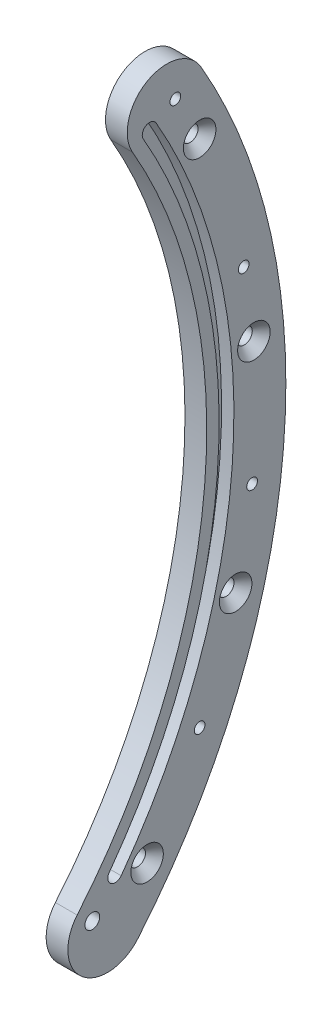
ISO-10303-21;
HEADER;
FILE_DESCRIPTION(('STEP AP214'),'2;1');
FILE_NAME('part.step','',(''),(''),'','','');
FILE_SCHEMA(('AUTOMOTIVE_DESIGN { 1 0 10303 214 1 1 1 1 }'));
ENDSEC;
DATA;
#1=APPLICATION_CONTEXT('core data for automotive mechanical design processes');
#2=APPLICATION_PROTOCOL_DEFINITION('international standard','automotive_design',2000,#1);
#3=PRODUCT_CONTEXT('',#1,'mechanical');
#4=PRODUCT('Part','Part','',(#3));
#5=PRODUCT_RELATED_PRODUCT_CATEGORY('part','',(#4));
#6=PRODUCT_DEFINITION_FORMATION('','',#4);
#7=PRODUCT_DEFINITION_CONTEXT('part definition',#1,'design');
#8=PRODUCT_DEFINITION('design','',#6,#7);
#9=PRODUCT_DEFINITION_SHAPE('','',#8);
#10=(LENGTH_UNIT() NAMED_UNIT(*) SI_UNIT(.MILLI.,.METRE.));
#11=(NAMED_UNIT(*) PLANE_ANGLE_UNIT() SI_UNIT($,.RADIAN.));
#12=(NAMED_UNIT(*) SI_UNIT($,.STERADIAN.) SOLID_ANGLE_UNIT());
#13=UNCERTAINTY_MEASURE_WITH_UNIT(LENGTH_MEASURE(1.E-05),#10,'distance_accuracy_value','');
#14=(GEOMETRIC_REPRESENTATION_CONTEXT(3) GLOBAL_UNCERTAINTY_ASSIGNED_CONTEXT((#13)) GLOBAL_UNIT_ASSIGNED_CONTEXT((#10,
#11,#12)) REPRESENTATION_CONTEXT('',''));
#15=CARTESIAN_POINT('',(0.,0.,0.));
#16=DIRECTION('',(0.,0.,1.));
#17=DIRECTION('',(1.,0.,0.));
#18=AXIS2_PLACEMENT_3D('',#15,#16,#17);
#19=CARTESIAN_POINT('',(-3.4925,95.2499999999996,-164.977839420936));
#20=DIRECTION('',(1.,0.,0.));
#21=DIRECTION('',(0.,0.,-1.));
#22=AXIS2_PLACEMENT_3D('',#19,#20,#21);
#23=CYLINDRICAL_SURFACE('',#22,12.7);
#24=CARTESIAN_POINT('',(3.4925,95.2499999999996,-164.977839420936));
#25=DIRECTION('',(1.,0.,0.));
#26=DIRECTION('',(0.,0.,-1.));
#27=AXIS2_PLACEMENT_3D('',#24,#25,#26);
#28=CIRCLE('',#27,12.7);
#29=CARTESIAN_POINT('',(3.4925,101.6,-175.976362048998));
#30=VERTEX_POINT('',#29);
#31=CARTESIAN_POINT('',(3.4925,88.8999999999996,-153.979316792873));
#32=VERTEX_POINT('',#31);
#33=EDGE_CURVE('E164',#30,#32,#28,.T.);
#34=ORIENTED_EDGE('',*,*,#33,.F.);
#35=DIRECTION('',(1.,0.,0.));
#36=VECTOR('',#35,1.);
#37=CARTESIAN_POINT('',(-3.4925,101.6,-175.976362048998));
#38=LINE('',#37,#36);
#39=CARTESIAN_POINT('',(-3.4925,101.6,-175.976362048998));
#40=VERTEX_POINT('',#39);
#41=EDGE_CURVE('E71',#40,#30,#38,.T.);
#42=ORIENTED_EDGE('',*,*,#41,.F.);
#43=CARTESIAN_POINT('',(-3.4925,95.2499999999996,-164.977839420936));
#44=DIRECTION('',(1.,0.,0.));
#45=DIRECTION('',(0.,0.,-1.));
#46=AXIS2_PLACEMENT_3D('',#43,#44,#45);
#47=CIRCLE('',#46,12.7);
#48=CARTESIAN_POINT('',(-3.4925,88.8999999999996,-153.979316792873));
#49=VERTEX_POINT('',#48);
#50=EDGE_CURVE('E169',#40,#49,#47,.T.);
#51=ORIENTED_EDGE('',*,*,#50,.T.);
#52=DIRECTION('',(1.,0.,0.));
#53=VECTOR('',#52,1.);
#54=CARTESIAN_POINT('',(-3.4925,88.8999999999996,-153.979316792873));
#55=LINE('',#54,#53);
#56=EDGE_CURVE('E100',#49,#32,#55,.T.);
#57=ORIENTED_EDGE('',*,*,#56,.T.);
#58=EDGE_LOOP('',(#34,#42,#51,#57));
#59=FACE_BOUND('',#58,.T.);
#60=ADVANCED_FACE('F43',(#59),#23,.T.);
#61=CARTESIAN_POINT('',(-3.4925,0.,0.));
#62=DIRECTION('',(1.,0.,0.));
#63=DIRECTION('',(0.,0.,-1.));
#64=AXIS2_PLACEMENT_3D('',#61,#62,#63);
#65=CYLINDRICAL_SURFACE('',#64,203.2);
#66=CARTESIAN_POINT('',(3.4925,0.,0.));
#67=DIRECTION('',(1.,0.,0.));
#68=DIRECTION('',(0.,0.,-1.));
#69=AXIS2_PLACEMENT_3D('',#66,#67,#68);
#70=CIRCLE('',#69,203.2);
#71=CARTESIAN_POINT('',(3.4925,-130.614442288306,-155.660230841776));
#72=VERTEX_POINT('',#71);
#73=EDGE_CURVE('E173',#72,#30,#70,.T.);
#74=ORIENTED_EDGE('',*,*,#73,.F.);
#75=DIRECTION('',(1.,0.,0.));
#76=VECTOR('',#75,1.);
#77=CARTESIAN_POINT('',(-3.4925,-130.614442288306,-155.660230841776));
#78=LINE('',#77,#76);
#79=CARTESIAN_POINT('',(-3.4925,-130.614442288306,-155.660230841776));
#80=VERTEX_POINT('',#79);
#81=EDGE_CURVE('E198',#80,#72,#78,.T.);
#82=ORIENTED_EDGE('',*,*,#81,.F.);
#83=CARTESIAN_POINT('',(-3.4925,0.,0.));
#84=DIRECTION('',(1.,0.,0.));
#85=DIRECTION('',(0.,0.,-1.));
#86=AXIS2_PLACEMENT_3D('',#83,#84,#85);
#87=CIRCLE('',#86,203.2);
#88=EDGE_CURVE('E180',#80,#40,#87,.T.);
#89=ORIENTED_EDGE('',*,*,#88,.T.);
#90=ORIENTED_EDGE('',*,*,#41,.T.);
#91=EDGE_LOOP('',(#74,#82,#89,#90));
#92=FACE_BOUND('',#91,.T.);
#93=ADVANCED_FACE('F229',(#92),#65,.T.);
#94=CARTESIAN_POINT('',(-3.4925,-122.451039645286,-145.931466414165));
#95=DIRECTION('',(1.,0.,0.));
#96=DIRECTION('',(0.,0.,-1.));
#97=AXIS2_PLACEMENT_3D('',#94,#95,#96);
#98=CYLINDRICAL_SURFACE('',#97,12.7);
#99=CARTESIAN_POINT('',(3.4925,-122.451039645286,-145.931466414165));
#100=DIRECTION('',(1.,0.,0.));
#101=DIRECTION('',(0.,0.,-1.));
#102=AXIS2_PLACEMENT_3D('',#99,#100,#101);
#103=CIRCLE('',#102,12.7);
#104=CARTESIAN_POINT('',(3.4925,-114.287637002267,-136.202701986554));
#105=VERTEX_POINT('',#104);
#106=EDGE_CURVE('E190',#105,#72,#103,.T.);
#107=ORIENTED_EDGE('',*,*,#106,.F.);
#108=DIRECTION('',(1.,0.,0.));
#109=VECTOR('',#108,1.);
#110=CARTESIAN_POINT('',(-3.4925,-114.287637002267,-136.202701986554));
#111=LINE('',#110,#109);
#112=CARTESIAN_POINT('',(-3.4925,-114.287637002267,-136.202701986554));
#113=VERTEX_POINT('',#112);
#114=EDGE_CURVE('E201',#113,#105,#111,.T.);
#115=ORIENTED_EDGE('',*,*,#114,.F.);
#116=CARTESIAN_POINT('',(-3.4925,-122.451039645286,-145.931466414165));
#117=DIRECTION('',(1.,0.,0.));
#118=DIRECTION('',(0.,0.,-1.));
#119=AXIS2_PLACEMENT_3D('',#116,#117,#118);
#120=CIRCLE('',#119,12.7);
#121=EDGE_CURVE('E176',#113,#80,#120,.T.);
#122=ORIENTED_EDGE('',*,*,#121,.T.);
#123=ORIENTED_EDGE('',*,*,#81,.T.);
#124=EDGE_LOOP('',(#107,#115,#122,#123));
#125=FACE_BOUND('',#124,.T.);
#126=ADVANCED_FACE('F228',(#125),#98,.T.);
#127=CARTESIAN_POINT('',(-3.4925,0.,0.));
#128=DIRECTION('',(1.,0.,0.));
#129=DIRECTION('',(0.,0.,-1.));
#130=AXIS2_PLACEMENT_3D('',#127,#128,#129);
#131=CYLINDRICAL_SURFACE('',#130,177.8);
#132=CARTESIAN_POINT('',(3.4925,0.,0.));
#133=DIRECTION('',(-1.,0.,0.));
#134=DIRECTION('',(0.,0.,1.));
#135=AXIS2_PLACEMENT_3D('',#132,#133,#134);
#136=CIRCLE('',#135,177.8);
#137=EDGE_CURVE('E186',#32,#105,#136,.T.);
#138=ORIENTED_EDGE('',*,*,#137,.F.);
#139=ORIENTED_EDGE('',*,*,#56,.F.);
#140=CARTESIAN_POINT('',(-3.4925,0.,0.));
#141=DIRECTION('',(-1.,0.,0.));
#142=DIRECTION('',(0.,0.,1.));
#143=AXIS2_PLACEMENT_3D('',#140,#141,#142);
#144=CIRCLE('',#143,177.8);
#145=EDGE_CURVE('E172',#49,#113,#144,.T.);
#146=ORIENTED_EDGE('',*,*,#145,.T.);
#147=ORIENTED_EDGE('',*,*,#114,.T.);
#148=EDGE_LOOP('',(#138,#139,#146,#147));
#149=FACE_BOUND('',#148,.T.);
#150=ADVANCED_FACE('F224',(#149),#131,.F.);
#151=CARTESIAN_POINT('',(-3.4925,47.6249999999998,-82.4889197104679));
#152=DIRECTION('',(1.,0.,0.));
#153=DIRECTION('',(0.,0.,-1.));
#154=AXIS2_PLACEMENT_3D('',#151,#152,#153);
#155=PLANE('',#154);
#156=CARTESIAN_POINT('',(-3.4925,96.8374999999974,-167.727470077952));
#157=DIRECTION('',(1.,0.,0.));
#158=DIRECTION('',(0.,0.,-1.));
#159=AXIS2_PLACEMENT_3D('',#156,#157,#158);
#160=CIRCLE('',#159,1.7272);
#161=CARTESIAN_POINT('',(-3.4925,96.8374999999974,-169.454670077952));
#162=VERTEX_POINT('',#161);
#163=EDGE_CURVE('E514',#162,#162,#160,.T.);
#164=ORIENTED_EDGE('',*,*,#163,.T.);
#165=EDGE_LOOP('',(#164));
#166=FACE_BOUND('',#165,.T.);
#167=CARTESIAN_POINT('',(-3.4925,39.1644883214046,-189.673794920444));
#168=DIRECTION('',(1.,0.,0.));
#169=DIRECTION('',(0.,0.,-1.));
#170=AXIS2_PLACEMENT_3D('',#167,#168,#169);
#171=CIRCLE('',#170,1.7272);
#172=CARTESIAN_POINT('',(-3.4925,39.1644883214046,-191.400994920444));
#173=VERTEX_POINT('',#172);
#174=EDGE_CURVE('E529',#173,#173,#171,.T.);
#175=ORIENTED_EDGE('',*,*,#174,.T.);
#176=EDGE_LOOP('',(#175));
#177=FACE_BOUND('',#176,.T.);
#178=CARTESIAN_POINT('',(-3.4925,-81.850591842633,-175.529160654322));
#179=DIRECTION('',(1.,0.,0.));
#180=DIRECTION('',(0.,0.,-1.));
#181=AXIS2_PLACEMENT_3D('',#178,#179,#180);
#182=CIRCLE('',#181,1.7272);
#183=CARTESIAN_POINT('',(-3.4925,-81.850591842633,-177.256360654322));
#184=VERTEX_POINT('',#183);
#185=EDGE_CURVE('E536',#184,#184,#182,.T.);
#186=ORIENTED_EDGE('',*,*,#185,.T.);
#187=EDGE_LOOP('',(#186));
#188=FACE_BOUND('',#187,.T.);
#189=CARTESIAN_POINT('',(-3.4925,-22.4842951432071,-192.36543893567));
#190=DIRECTION('',(1.,0.,0.));
#191=DIRECTION('',(0.,0.,-1.));
#192=AXIS2_PLACEMENT_3D('',#189,#190,#191);
#193=CIRCLE('',#192,1.7272);
#194=CARTESIAN_POINT('',(-3.4925,-22.4842951432071,-194.09263893567));
#195=VERTEX_POINT('',#194);
#196=EDGE_CURVE('E542',#195,#195,#193,.T.);
#197=ORIENTED_EDGE('',*,*,#196,.T.);
#198=EDGE_LOOP('',(#197));
#199=FACE_BOUND('',#198,.T.);
#200=CARTESIAN_POINT('',(-3.4925,-118.369338323777,-141.067084200359));
#201=DIRECTION('',(-1.,0.,0.));
#202=DIRECTION('',(0.,0.,1.));
#203=AXIS2_PLACEMENT_3D('',#200,#201,#202);
#204=CIRCLE('',#203,2.38125);
#205=CARTESIAN_POINT('',(-3.4925,-118.369338323777,-138.685834200359));
#206=VERTEX_POINT('',#205);
#207=EDGE_CURVE('E545',#206,#206,#204,.T.);
#208=ORIENTED_EDGE('',*,*,#207,.F.);
#209=EDGE_LOOP('',(#208));
#210=FACE_BOUND('',#209,.T.);
#211=CARTESIAN_POINT('',(-3.4925,81.8505918426279,-175.529160654327));
#212=DIRECTION('',(1.,0.,0.));
#213=DIRECTION('',(0.,0.,-1.));
#214=AXIS2_PLACEMENT_3D('',#211,#212,#213);
#215=CIRCLE('',#214,2.55270000000001);
#216=CARTESIAN_POINT('',(-3.4925,81.8505918426279,-178.081860654327));
#217=VERTEX_POINT('',#216);
#218=EDGE_CURVE('E555',#217,#217,#215,.T.);
#219=ORIENTED_EDGE('',*,*,#218,.T.);
#220=EDGE_LOOP('',(#219));
#221=FACE_BOUND('',#220,.T.);
#222=CARTESIAN_POINT('',(-3.4925,16.8798884766493,-192.938008152921));
#223=DIRECTION('',(1.,0.,0.));
#224=DIRECTION('',(0.,0.,-1.));
#225=AXIS2_PLACEMENT_3D('',#222,#223,#224);
#226=CIRCLE('',#225,2.5527);
#227=CARTESIAN_POINT('',(-3.4925,16.8798884766493,-195.490708152921));
#228=VERTEX_POINT('',#227);
#229=EDGE_CURVE('E280',#228,#228,#226,.T.);
#230=ORIENTED_EDGE('',*,*,#229,.T.);
#231=EDGE_LOOP('',(#230));
#232=FACE_BOUND('',#231,.T.);
#233=CARTESIAN_POINT('',(-3.4925,-50.1267785602348,-187.075684406536));
#234=DIRECTION('',(1.,0.,0.));
#235=DIRECTION('',(0.,0.,-1.));
#236=AXIS2_PLACEMENT_3D('',#233,#234,#235);
#237=CIRCLE('',#236,2.5527);
#238=CARTESIAN_POINT('',(-3.4925,-50.1267785602348,-189.628384406536));
#239=VERTEX_POINT('',#238);
#240=EDGE_CURVE('E271',#239,#239,#237,.T.);
#241=ORIENTED_EDGE('',*,*,#240,.T.);
#242=EDGE_LOOP('',(#241));
#243=FACE_BOUND('',#242,.T.);
#244=CARTESIAN_POINT('',(-3.4925,-111.087416310293,-158.64927217767));
#245=DIRECTION('',(1.,0.,0.));
#246=DIRECTION('',(0.,0.,-1.));
#247=AXIS2_PLACEMENT_3D('',#244,#245,#246);
#248=CIRCLE('',#247,2.55270000000001);
#249=CARTESIAN_POINT('',(-3.4925,-111.087416310293,-161.20197217767));
#250=VERTEX_POINT('',#249);
#251=EDGE_CURVE('E149',#250,#250,#248,.T.);
#252=ORIENTED_EDGE('',*,*,#251,.T.);
#253=EDGE_LOOP('',(#252));
#254=FACE_BOUND('',#253,.T.);
#255=ORIENTED_EDGE('',*,*,#50,.F.);
#256=ORIENTED_EDGE('',*,*,#88,.F.);
#257=ORIENTED_EDGE('',*,*,#121,.F.);
#258=ORIENTED_EDGE('',*,*,#145,.F.);
#259=EDGE_LOOP('',(#255,#256,#257,#258));
#260=FACE_BOUND('',#259,.T.);
#261=ADVANCED_FACE('F221',(#166,#177,#188,#199,#210,#221,#232,#243,#254,#260),#155,.F.);
#262=CARTESIAN_POINT('',(3.4925,47.6249999999998,-82.4889197104679));
#263=DIRECTION('',(1.,0.,0.));
#264=DIRECTION('',(0.,0.,-1.));
#265=AXIS2_PLACEMENT_3D('',#262,#263,#264);
#266=PLANE('',#265);
#267=CARTESIAN_POINT('',(3.4925,96.8374999999974,-167.727470077952));
#268=DIRECTION('',(1.,0.,0.));
#269=DIRECTION('',(0.,0.,-1.));
#270=AXIS2_PLACEMENT_3D('',#267,#268,#269);
#271=CIRCLE('',#270,1.7272);
#272=CARTESIAN_POINT('',(3.4925,96.8374999999974,-169.454670077952));
#273=VERTEX_POINT('',#272);
#274=EDGE_CURVE('E517',#273,#273,#271,.T.);
#275=ORIENTED_EDGE('',*,*,#274,.F.);
#276=EDGE_LOOP('',(#275));
#277=FACE_BOUND('',#276,.T.);
#278=CARTESIAN_POINT('',(3.4925,39.1644883214046,-189.673794920444));
#279=DIRECTION('',(1.,0.,0.));
#280=DIRECTION('',(0.,0.,-1.));
#281=AXIS2_PLACEMENT_3D('',#278,#279,#280);
#282=CIRCLE('',#281,1.7272);
#283=CARTESIAN_POINT('',(3.4925,39.1644883214046,-191.400994920444));
#284=VERTEX_POINT('',#283);
#285=EDGE_CURVE('E523',#284,#284,#282,.T.);
#286=ORIENTED_EDGE('',*,*,#285,.F.);
#287=EDGE_LOOP('',(#286));
#288=FACE_BOUND('',#287,.T.);
#289=CARTESIAN_POINT('',(3.4925,-81.850591842633,-175.529160654322));
#290=DIRECTION('',(1.,0.,0.));
#291=DIRECTION('',(0.,0.,-1.));
#292=AXIS2_PLACEMENT_3D('',#289,#290,#291);
#293=CIRCLE('',#292,1.7272);
#294=CARTESIAN_POINT('',(3.4925,-81.850591842633,-177.256360654322));
#295=VERTEX_POINT('',#294);
#296=EDGE_CURVE('E533',#295,#295,#293,.T.);
#297=ORIENTED_EDGE('',*,*,#296,.F.);
#298=EDGE_LOOP('',(#297));
#299=FACE_BOUND('',#298,.T.);
#300=CARTESIAN_POINT('',(3.4925,-22.4842951432071,-192.36543893567));
#301=DIRECTION('',(1.,0.,0.));
#302=DIRECTION('',(0.,0.,-1.));
#303=AXIS2_PLACEMENT_3D('',#300,#301,#302);
#304=CIRCLE('',#303,1.7272);
#305=CARTESIAN_POINT('',(3.4925,-22.4842951432071,-194.09263893567));
#306=VERTEX_POINT('',#305);
#307=EDGE_CURVE('E539',#306,#306,#304,.T.);
#308=ORIENTED_EDGE('',*,*,#307,.F.);
#309=EDGE_LOOP('',(#308));
#310=FACE_BOUND('',#309,.T.);
#311=CARTESIAN_POINT('',(3.4925,-118.369338323777,-141.067084200359));
#312=DIRECTION('',(1.,0.,0.));
#313=DIRECTION('',(0.,0.,-1.));
#314=AXIS2_PLACEMENT_3D('',#311,#312,#313);
#315=CIRCLE('',#314,2.38125);
#316=CARTESIAN_POINT('',(3.4925,-118.369338323777,-138.685834200359));
#317=VERTEX_POINT('',#316);
#318=EDGE_CURVE('E46',#317,#317,#315,.T.);
#319=ORIENTED_EDGE('',*,*,#318,.F.);
#320=EDGE_LOOP('',(#319));
#321=FACE_BOUND('',#320,.T.);
#322=CARTESIAN_POINT('',(3.4925,81.8505918426279,-175.529160654327));
#323=DIRECTION('',(1.,0.,0.));
#324=DIRECTION('',(0.,0.,-1.));
#325=AXIS2_PLACEMENT_3D('',#322,#323,#324);
#326=CIRCLE('',#325,5.21969999999999);
#327=CARTESIAN_POINT('',(3.4925,81.8505918426279,-180.748860654327));
#328=VERTEX_POINT('',#327);
#329=EDGE_CURVE('E549',#328,#328,#326,.T.);
#330=ORIENTED_EDGE('',*,*,#329,.F.);
#331=EDGE_LOOP('',(#330));
#332=FACE_BOUND('',#331,.T.);
#333=CARTESIAN_POINT('',(3.4925,16.8798884766493,-192.938008152921));
#334=DIRECTION('',(1.,0.,0.));
#335=DIRECTION('',(0.,0.,-1.));
#336=AXIS2_PLACEMENT_3D('',#333,#334,#335);
#337=CIRCLE('',#336,5.2197);
#338=CARTESIAN_POINT('',(3.4925,16.8798884766493,-198.157708152921));
#339=VERTEX_POINT('',#338);
#340=EDGE_CURVE('E281',#339,#339,#337,.T.);
#341=ORIENTED_EDGE('',*,*,#340,.F.);
#342=EDGE_LOOP('',(#341));
#343=FACE_BOUND('',#342,.T.);
#344=CARTESIAN_POINT('',(3.4925,-50.1267785602348,-187.075684406536));
#345=DIRECTION('',(1.,0.,0.));
#346=DIRECTION('',(0.,0.,-1.));
#347=AXIS2_PLACEMENT_3D('',#344,#345,#346);
#348=CIRCLE('',#347,5.2197);
#349=CARTESIAN_POINT('',(3.4925,-50.1267785602348,-192.295384406536));
#350=VERTEX_POINT('',#349);
#351=EDGE_CURVE('E272',#350,#350,#348,.T.);
#352=ORIENTED_EDGE('',*,*,#351,.F.);
#353=EDGE_LOOP('',(#352));
#354=FACE_BOUND('',#353,.T.);
#355=CARTESIAN_POINT('',(3.4925,-111.087416310293,-158.64927217767));
#356=DIRECTION('',(1.,0.,0.));
#357=DIRECTION('',(0.,0.,-1.));
#358=AXIS2_PLACEMENT_3D('',#355,#356,#357);
#359=CIRCLE('',#358,5.21969999999999);
#360=CARTESIAN_POINT('',(3.4925,-111.087416310293,-163.86897217767));
#361=VERTEX_POINT('',#360);
#362=EDGE_CURVE('E295',#361,#361,#359,.T.);
#363=ORIENTED_EDGE('',*,*,#362,.F.);
#364=EDGE_LOOP('',(#363));
#365=FACE_BOUND('',#364,.T.);
#366=CARTESIAN_POINT('',(3.4925,0.,0.));
#367=DIRECTION('',(1.,0.,0.));
#368=DIRECTION('',(0.,0.,-1.));
#369=AXIS2_PLACEMENT_3D('',#366,#367,#368);
#370=CIRCLE('',#369,186.53125);
#371=CARTESIAN_POINT('',(3.4925,-110.415539748432,-150.340665851342));
#372=VERTEX_POINT('',#371);
#373=CARTESIAN_POINT('',(3.4925,93.265625,-161.540801099666));
#374=VERTEX_POINT('',#373);
#375=EDGE_CURVE('E11',#372,#374,#370,.T.);
#376=ORIENTED_EDGE('',*,*,#375,.F.);
#377=CARTESIAN_POINT('',(3.4925,-109.005979666537,-148.421423308559));
#378=DIRECTION('',(1.,0.,0.));
#379=DIRECTION('',(0.,0.,-1.));
#380=AXIS2_PLACEMENT_3D('',#377,#378,#379);
#381=CIRCLE('',#380,2.38124999999996);
#382=CARTESIAN_POINT('',(3.4925,-107.596419584642,-146.502180765776));
#383=VERTEX_POINT('',#382);
#384=EDGE_CURVE('E129',#383,#372,#381,.T.);
#385=ORIENTED_EDGE('',*,*,#384,.F.);
#386=CARTESIAN_POINT('',(3.4925,0.,0.));
#387=DIRECTION('',(1.,0.,0.));
#388=DIRECTION('',(0.,0.,-1.));
#389=AXIS2_PLACEMENT_3D('',#386,#387,#388);
#390=CIRCLE('',#389,181.76875);
#391=CARTESIAN_POINT('',(3.4925,90.884375,-157.416355114143));
#392=VERTEX_POINT('',#391);
#393=EDGE_CURVE('E206',#383,#392,#390,.T.);
#394=ORIENTED_EDGE('',*,*,#393,.T.);
#395=CARTESIAN_POINT('',(3.4925,92.075,-159.478578106904));
#396=DIRECTION('',(1.,0.,0.));
#397=DIRECTION('',(0.,0.,-1.));
#398=AXIS2_PLACEMENT_3D('',#395,#396,#397);
#399=CIRCLE('',#398,2.38124999999998);
#400=EDGE_CURVE('E52',#374,#392,#399,.T.);
#401=ORIENTED_EDGE('',*,*,#400,.F.);
#402=EDGE_LOOP('',(#376,#385,#394,#401));
#403=FACE_BOUND('',#402,.T.);
#404=ORIENTED_EDGE('',*,*,#33,.T.);
#405=ORIENTED_EDGE('',*,*,#137,.T.);
#406=ORIENTED_EDGE('',*,*,#106,.T.);
#407=ORIENTED_EDGE('',*,*,#73,.T.);
#408=EDGE_LOOP('',(#404,#405,#406,#407));
#409=FACE_BOUND('',#408,.T.);
#410=ADVANCED_FACE('F218',(#277,#288,#299,#310,#321,#332,#343,#354,#365,#403,#409),#266,.T.);
#411=CARTESIAN_POINT('',(7.46125,0.,0.));
#412=DIRECTION('',(-1.,0.,0.));
#413=DIRECTION('',(0.,0.,1.));
#414=AXIS2_PLACEMENT_3D('',#411,#412,#413);
#415=CYLINDRICAL_SURFACE('',#414,186.53125);
#416=ORIENTED_EDGE('',*,*,#375,.T.);
#417=DIRECTION('',(-1.,0.,0.));
#418=VECTOR('',#417,1.);
#419=CARTESIAN_POINT('',(7.46125,93.265625,-161.540801099666));
#420=LINE('',#419,#418);
#421=CARTESIAN_POINT('',(-0.47625,93.265625,-161.540801099666));
#422=VERTEX_POINT('',#421);
#423=EDGE_CURVE('E147',#374,#422,#420,.T.);
#424=ORIENTED_EDGE('',*,*,#423,.T.);
#425=CARTESIAN_POINT('',(-0.47625,0.,0.));
#426=DIRECTION('',(-1.,0.,0.));
#427=DIRECTION('',(0.,0.,1.));
#428=AXIS2_PLACEMENT_3D('',#425,#426,#427);
#429=CIRCLE('',#428,186.53125);
#430=CARTESIAN_POINT('',(-0.47625,-110.415539748432,-150.340665851342));
#431=VERTEX_POINT('',#430);
#432=EDGE_CURVE('E140',#422,#431,#429,.T.);
#433=ORIENTED_EDGE('',*,*,#432,.T.);
#434=DIRECTION('',(-1.,0.,0.));
#435=VECTOR('',#434,1.);
#436=CARTESIAN_POINT('',(7.46125,-110.415539748432,-150.340665851342));
#437=LINE('',#436,#435);
#438=EDGE_CURVE('E124',#372,#431,#437,.T.);
#439=ORIENTED_EDGE('',*,*,#438,.F.);
#440=EDGE_LOOP('',(#416,#424,#433,#439));
#441=FACE_BOUND('',#440,.T.);
#442=ADVANCED_FACE('F145',(#441),#415,.F.);
#443=CARTESIAN_POINT('',(7.46125,92.075,-159.478578106904));
#444=DIRECTION('',(-1.,0.,0.));
#445=DIRECTION('',(0.,0.,1.));
#446=AXIS2_PLACEMENT_3D('',#443,#444,#445);
#447=CYLINDRICAL_SURFACE('',#446,2.38124999999998);
#448=ORIENTED_EDGE('',*,*,#400,.T.);
#449=DIRECTION('',(-1.,0.,0.));
#450=VECTOR('',#449,1.);
#451=CARTESIAN_POINT('',(7.46125,90.884375,-157.416355114143));
#452=LINE('',#451,#450);
#453=CARTESIAN_POINT('',(-0.47625,90.884375,-157.416355114143));
#454=VERTEX_POINT('',#453);
#455=EDGE_CURVE('E165',#392,#454,#452,.T.);
#456=ORIENTED_EDGE('',*,*,#455,.T.);
#457=CARTESIAN_POINT('',(-0.47625,92.075,-159.478578106904));
#458=DIRECTION('',(-1.,0.,0.));
#459=DIRECTION('',(0.,0.,1.));
#460=AXIS2_PLACEMENT_3D('',#457,#458,#459);
#461=CIRCLE('',#460,2.38124999999998);
#462=EDGE_CURVE('E133',#454,#422,#461,.T.);
#463=ORIENTED_EDGE('',*,*,#462,.T.);
#464=ORIENTED_EDGE('',*,*,#423,.F.);
#465=EDGE_LOOP('',(#448,#456,#463,#464));
#466=FACE_BOUND('',#465,.T.);
#467=ADVANCED_FACE('F214',(#466),#447,.F.);
#468=CARTESIAN_POINT('',(7.46125,0.,0.));
#469=DIRECTION('',(-1.,0.,0.));
#470=DIRECTION('',(0.,0.,1.));
#471=AXIS2_PLACEMENT_3D('',#468,#469,#470);
#472=CYLINDRICAL_SURFACE('',#471,181.76875);
#473=DIRECTION('',(-1.,0.,0.));
#474=VECTOR('',#473,1.);
#475=CARTESIAN_POINT('',(7.46125,-107.596419584642,-146.502180765776));
#476=LINE('',#475,#474);
#477=CARTESIAN_POINT('',(-0.47625,-107.596419584642,-146.502180765776));
#478=VERTEX_POINT('',#477);
#479=EDGE_CURVE('E59',#383,#478,#476,.T.);
#480=ORIENTED_EDGE('',*,*,#479,.T.);
#481=CARTESIAN_POINT('',(-0.47625,0.,0.));
#482=DIRECTION('',(-1.,0.,0.));
#483=DIRECTION('',(0.,0.,1.));
#484=AXIS2_PLACEMENT_3D('',#481,#482,#483);
#485=CIRCLE('',#484,181.76875);
#486=EDGE_CURVE('E143',#454,#478,#485,.T.);
#487=ORIENTED_EDGE('',*,*,#486,.F.);
#488=ORIENTED_EDGE('',*,*,#455,.F.);
#489=ORIENTED_EDGE('',*,*,#393,.F.);
#490=EDGE_LOOP('',(#480,#487,#488,#489));
#491=FACE_BOUND('',#490,.T.);
#492=ADVANCED_FACE('F217',(#491),#472,.T.);
#493=CARTESIAN_POINT('',(7.46125,-109.005979666537,-148.421423308559));
#494=DIRECTION('',(-1.,0.,0.));
#495=DIRECTION('',(0.,0.,1.));
#496=AXIS2_PLACEMENT_3D('',#493,#494,#495);
#497=CYLINDRICAL_SURFACE('',#496,2.38124999999996);
#498=ORIENTED_EDGE('',*,*,#384,.T.);
#499=ORIENTED_EDGE('',*,*,#438,.T.);
#500=CARTESIAN_POINT('',(-0.47625,-109.005979666537,-148.421423308559));
#501=DIRECTION('',(-1.,0.,0.));
#502=DIRECTION('',(0.,0.,1.));
#503=AXIS2_PLACEMENT_3D('',#500,#501,#502);
#504=CIRCLE('',#503,2.38124999999996);
#505=EDGE_CURVE('E127',#431,#478,#504,.T.);
#506=ORIENTED_EDGE('',*,*,#505,.T.);
#507=ORIENTED_EDGE('',*,*,#479,.F.);
#508=EDGE_LOOP('',(#498,#499,#506,#507));
#509=FACE_BOUND('',#508,.T.);
#510=ADVANCED_FACE('F126',(#509),#497,.F.);
#511=CARTESIAN_POINT('',(-0.47625,0.,0.));
#512=DIRECTION('',(-1.,0.,0.));
#513=DIRECTION('',(0.,0.,1.));
#514=AXIS2_PLACEMENT_3D('',#511,#512,#513);
#515=PLANE('',#514);
#516=ORIENTED_EDGE('',*,*,#432,.F.);
#517=ORIENTED_EDGE('',*,*,#462,.F.);
#518=ORIENTED_EDGE('',*,*,#486,.T.);
#519=ORIENTED_EDGE('',*,*,#505,.F.);
#520=EDGE_LOOP('',(#516,#517,#518,#519));
#521=FACE_BOUND('',#520,.T.);
#522=ADVANCED_FACE('F138',(#521),#515,.F.);
#523=CARTESIAN_POINT('',(3.4925,-111.087416310293,-158.64927217767));
#524=DIRECTION('',(1.,0.,0.));
#525=DIRECTION('',(0.,0.,-1.));
#526=AXIS2_PLACEMENT_3D('',#523,#524,#525);
#527=CYLINDRICAL_SURFACE('',#526,2.55270000000001);
#528=ORIENTED_EDGE('',*,*,#251,.F.);
#529=EDGE_LOOP('',(#528));
#530=FACE_BOUND('',#529,.T.);
#531=CARTESIAN_POINT('',(0.424467457941568,-111.087416310293,-158.64927217767));
#532=DIRECTION('',(1.,0.,0.));
#533=DIRECTION('',(0.,0.,-1.));
#534=AXIS2_PLACEMENT_3D('',#531,#532,#533);
#535=CIRCLE('',#534,2.55270000000001);
#536=CARTESIAN_POINT('',(0.424467457941568,-111.087416310293,-161.20197217767));
#537=VERTEX_POINT('',#536);
#538=EDGE_CURVE('E155',#537,#537,#535,.T.);
#539=ORIENTED_EDGE('',*,*,#538,.T.);
#540=EDGE_LOOP('',(#539));
#541=FACE_BOUND('',#540,.T.);
#542=ADVANCED_FACE('F300',(#530,#541),#527,.F.);
#543=CARTESIAN_POINT('',(3.4925,-111.087416310293,-158.64927217767));
#544=DIRECTION('',(1.,0.,0.));
#545=DIRECTION('',(0.,0.,-1.));
#546=AXIS2_PLACEMENT_3D('',#543,#544,#545);
#547=CONICAL_SURFACE('',#546,5.21969999999999,0.715584993317673);
#548=ORIENTED_EDGE('',*,*,#538,.F.);
#549=EDGE_LOOP('',(#548));
#550=FACE_BOUND('',#549,.T.);
#551=ORIENTED_EDGE('',*,*,#362,.T.);
#552=EDGE_LOOP('',(#551));
#553=FACE_BOUND('',#552,.T.);
#554=ADVANCED_FACE('F302',(#550,#553),#547,.F.);
#555=CARTESIAN_POINT('',(3.4925,-50.1267785602348,-187.075684406536));
#556=DIRECTION('',(1.,0.,0.));
#557=DIRECTION('',(0.,0.,-1.));
#558=AXIS2_PLACEMENT_3D('',#555,#556,#557);
#559=CYLINDRICAL_SURFACE('',#558,2.5527);
#560=ORIENTED_EDGE('',*,*,#240,.F.);
#561=EDGE_LOOP('',(#560));
#562=FACE_BOUND('',#561,.T.);
#563=CARTESIAN_POINT('',(0.424467457941568,-50.1267785602348,-187.075684406536));
#564=DIRECTION('',(1.,0.,0.));
#565=DIRECTION('',(0.,0.,-1.));
#566=AXIS2_PLACEMENT_3D('',#563,#564,#565);
#567=CIRCLE('',#566,2.5527);
#568=CARTESIAN_POINT('',(0.424467457941568,-50.1267785602348,-189.628384406536));
#569=VERTEX_POINT('',#568);
#570=EDGE_CURVE('E266',#569,#569,#567,.T.);
#571=ORIENTED_EDGE('',*,*,#570,.T.);
#572=EDGE_LOOP('',(#571));
#573=FACE_BOUND('',#572,.T.);
#574=ADVANCED_FACE('F305',(#562,#573),#559,.F.);
#575=CARTESIAN_POINT('',(3.4925,-50.1267785602348,-187.075684406536));
#576=DIRECTION('',(1.,0.,0.));
#577=DIRECTION('',(0.,0.,-1.));
#578=AXIS2_PLACEMENT_3D('',#575,#576,#577);
#579=CONICAL_SURFACE('',#578,5.2197,0.715584993317676);
#580=ORIENTED_EDGE('',*,*,#570,.F.);
#581=EDGE_LOOP('',(#580));
#582=FACE_BOUND('',#581,.T.);
#583=ORIENTED_EDGE('',*,*,#351,.T.);
#584=EDGE_LOOP('',(#583));
#585=FACE_BOUND('',#584,.T.);
#586=ADVANCED_FACE('F313',(#582,#585),#579,.F.);
#587=CARTESIAN_POINT('',(3.4925,16.8798884766493,-192.938008152921));
#588=DIRECTION('',(1.,0.,0.));
#589=DIRECTION('',(0.,0.,-1.));
#590=AXIS2_PLACEMENT_3D('',#587,#588,#589);
#591=CYLINDRICAL_SURFACE('',#590,2.5527);
#592=ORIENTED_EDGE('',*,*,#229,.F.);
#593=EDGE_LOOP('',(#592));
#594=FACE_BOUND('',#593,.T.);
#595=CARTESIAN_POINT('',(0.424467457941568,16.8798884766493,-192.938008152921));
#596=DIRECTION('',(1.,0.,0.));
#597=DIRECTION('',(0.,0.,-1.));
#598=AXIS2_PLACEMENT_3D('',#595,#596,#597);
#599=CIRCLE('',#598,2.5527);
#600=CARTESIAN_POINT('',(0.424467457941568,16.8798884766493,-195.490708152921));
#601=VERTEX_POINT('',#600);
#602=EDGE_CURVE('E276',#601,#601,#599,.T.);
#603=ORIENTED_EDGE('',*,*,#602,.T.);
#604=EDGE_LOOP('',(#603));
#605=FACE_BOUND('',#604,.T.);
#606=ADVANCED_FACE('F372',(#594,#605),#591,.F.);
#607=CARTESIAN_POINT('',(3.4925,16.8798884766493,-192.938008152921));
#608=DIRECTION('',(1.,0.,0.));
#609=DIRECTION('',(0.,0.,-1.));
#610=AXIS2_PLACEMENT_3D('',#607,#608,#609);
#611=CONICAL_SURFACE('',#610,5.2197,0.715584993317676);
#612=ORIENTED_EDGE('',*,*,#602,.F.);
#613=EDGE_LOOP('',(#612));
#614=FACE_BOUND('',#613,.T.);
#615=ORIENTED_EDGE('',*,*,#340,.T.);
#616=EDGE_LOOP('',(#615));
#617=FACE_BOUND('',#616,.T.);
#618=ADVANCED_FACE('F381',(#614,#617),#611,.F.);
#619=CARTESIAN_POINT('',(3.4925,81.8505918426279,-175.529160654327));
#620=DIRECTION('',(1.,0.,0.));
#621=DIRECTION('',(0.,0.,-1.));
#622=AXIS2_PLACEMENT_3D('',#619,#620,#621);
#623=CYLINDRICAL_SURFACE('',#622,2.55270000000001);
#624=ORIENTED_EDGE('',*,*,#218,.F.);
#625=EDGE_LOOP('',(#624));
#626=FACE_BOUND('',#625,.T.);
#627=CARTESIAN_POINT('',(0.424467457941568,81.8505918426279,-175.529160654327));
#628=DIRECTION('',(1.,0.,0.));
#629=DIRECTION('',(0.,0.,-1.));
#630=AXIS2_PLACEMENT_3D('',#627,#628,#629);
#631=CIRCLE('',#630,2.55270000000001);
#632=CARTESIAN_POINT('',(0.424467457941568,81.8505918426279,-178.081860654327));
#633=VERTEX_POINT('',#632);
#634=EDGE_CURVE('E552',#633,#633,#631,.T.);
#635=ORIENTED_EDGE('',*,*,#634,.T.);
#636=EDGE_LOOP('',(#635));
#637=FACE_BOUND('',#636,.T.);
#638=ADVANCED_FACE('F391',(#626,#637),#623,.F.);
#639=CARTESIAN_POINT('',(3.4925,81.8505918426279,-175.529160654327));
#640=DIRECTION('',(1.,0.,0.));
#641=DIRECTION('',(0.,0.,-1.));
#642=AXIS2_PLACEMENT_3D('',#639,#640,#641);
#643=CONICAL_SURFACE('',#642,5.21969999999999,0.715584993317673);
#644=ORIENTED_EDGE('',*,*,#634,.F.);
#645=EDGE_LOOP('',(#644));
#646=FACE_BOUND('',#645,.T.);
#647=ORIENTED_EDGE('',*,*,#329,.T.);
#648=EDGE_LOOP('',(#647));
#649=FACE_BOUND('',#648,.T.);
#650=ADVANCED_FACE('F401',(#646,#649),#643,.F.);
#651=CARTESIAN_POINT('',(3.492512,-118.369338323777,-141.067084200359));
#652=DIRECTION('',(-1.,0.,0.));
#653=DIRECTION('',(0.,0.,1.));
#654=AXIS2_PLACEMENT_3D('',#651,#652,#653);
#655=CYLINDRICAL_SURFACE('',#654,2.38125);
#656=CARTESIAN_POINT('',(3.4925,-118.369338323777,-138.685834200359));
#657=CARTESIAN_POINT('',(3.41973958333333,-118.369338323777,-138.685834200359));
#658=CARTESIAN_POINT('',(3.34697916666667,-118.369338323777,-138.685834200359));
#659=CARTESIAN_POINT('',(3.20145833333333,-118.369338323777,-138.685834200359));
#660=CARTESIAN_POINT('',(3.12869791666667,-118.369338323777,-138.685834200359));
#661=CARTESIAN_POINT('',(2.98317708333333,-118.369338323777,-138.685834200359));
#662=CARTESIAN_POINT('',(2.91041666666667,-118.369338323777,-138.685834200359));
#663=CARTESIAN_POINT('',(2.76489583333333,-118.369338323777,-138.685834200359));
#664=CARTESIAN_POINT('',(2.69213541666667,-118.369338323777,-138.685834200359));
#665=CARTESIAN_POINT('',(2.54661458333333,-118.369338323777,-138.685834200359));
#666=CARTESIAN_POINT('',(2.47385416666667,-118.369338323777,-138.685834200359));
#667=CARTESIAN_POINT('',(2.32833333333333,-118.369338323777,-138.685834200359));
#668=CARTESIAN_POINT('',(2.25557291666667,-118.369338323777,-138.685834200359));
#669=CARTESIAN_POINT('',(2.11005208333333,-118.369338323777,-138.685834200359));
#670=CARTESIAN_POINT('',(2.03729166666667,-118.369338323777,-138.685834200359));
#671=CARTESIAN_POINT('',(1.89177083333333,-118.369338323777,-138.685834200359));
#672=CARTESIAN_POINT('',(1.81901041666667,-118.369338323777,-138.685834200359));
#673=CARTESIAN_POINT('',(1.67348958333333,-118.369338323777,-138.685834200359));
#674=CARTESIAN_POINT('',(1.60072916666667,-118.369338323777,-138.685834200359));
#675=CARTESIAN_POINT('',(1.45520833333333,-118.369338323777,-138.685834200359));
#676=CARTESIAN_POINT('',(1.38244791666667,-118.369338323777,-138.685834200359));
#677=CARTESIAN_POINT('',(1.23692708333333,-118.369338323777,-138.685834200359));
#678=CARTESIAN_POINT('',(1.16416666666667,-118.369338323777,-138.685834200359));
#679=CARTESIAN_POINT('',(1.01864583333333,-118.369338323777,-138.685834200359));
#680=CARTESIAN_POINT('',(0.945885416666667,-118.369338323777,-138.685834200359));
#681=CARTESIAN_POINT('',(0.800364583333333,-118.369338323777,-138.685834200359));
#682=CARTESIAN_POINT('',(0.727604166666666,-118.369338323777,-138.685834200359));
#683=CARTESIAN_POINT('',(0.582083333333333,-118.369338323777,-138.685834200359));
#684=CARTESIAN_POINT('',(0.509322916666666,-118.369338323777,-138.685834200359));
#685=CARTESIAN_POINT('',(0.363802083333333,-118.369338323777,-138.685834200359));
#686=CARTESIAN_POINT('',(0.291041666666667,-118.369338323777,-138.685834200359));
#687=CARTESIAN_POINT('',(0.145520833333333,-118.369338323777,-138.685834200359));
#688=CARTESIAN_POINT('',(0.0727604166666665,-118.369338323777,-138.685834200359));
#689=CARTESIAN_POINT('',(-0.072760416666667,-118.369338323777,-138.685834200359));
#690=CARTESIAN_POINT('',(-0.145520833333334,-118.369338323777,-138.685834200359));
#691=CARTESIAN_POINT('',(-0.291041666666667,-118.369338323777,-138.685834200359));
#692=CARTESIAN_POINT('',(-0.363802083333334,-118.369338323777,-138.685834200359));
#693=CARTESIAN_POINT('',(-0.509322916666667,-118.369338323777,-138.685834200359));
#694=CARTESIAN_POINT('',(-0.582083333333333,-118.369338323777,-138.685834200359));
#695=CARTESIAN_POINT('',(-0.727604166666667,-118.369338323777,-138.685834200359));
#696=CARTESIAN_POINT('',(-0.800364583333334,-118.369338323777,-138.685834200359));
#697=CARTESIAN_POINT('',(-0.945885416666667,-118.369338323777,-138.685834200359));
#698=CARTESIAN_POINT('',(-1.01864583333333,-118.369338323777,-138.685834200359));
#699=CARTESIAN_POINT('',(-1.16416666666667,-118.369338323777,-138.685834200359));
#700=CARTESIAN_POINT('',(-1.23692708333333,-118.369338323777,-138.685834200359));
#701=CARTESIAN_POINT('',(-1.38244791666667,-118.369338323777,-138.685834200359));
#702=CARTESIAN_POINT('',(-1.45520833333333,-118.369338323777,-138.685834200359));
#703=CARTESIAN_POINT('',(-1.60072916666667,-118.369338323777,-138.685834200359));
#704=CARTESIAN_POINT('',(-1.67348958333333,-118.369338323777,-138.685834200359));
#705=CARTESIAN_POINT('',(-1.81901041666667,-118.369338323777,-138.685834200359));
#706=CARTESIAN_POINT('',(-1.89177083333333,-118.369338323777,-138.685834200359));
#707=CARTESIAN_POINT('',(-2.03729166666667,-118.369338323777,-138.685834200359));
#708=CARTESIAN_POINT('',(-2.11005208333333,-118.369338323777,-138.685834200359));
#709=CARTESIAN_POINT('',(-2.25557291666667,-118.369338323777,-138.685834200359));
#710=CARTESIAN_POINT('',(-2.32833333333333,-118.369338323777,-138.685834200359));
#711=CARTESIAN_POINT('',(-2.47385416666667,-118.369338323777,-138.685834200359));
#712=CARTESIAN_POINT('',(-2.54661458333333,-118.369338323777,-138.685834200359));
#713=CARTESIAN_POINT('',(-2.69213541666667,-118.369338323777,-138.685834200359));
#714=CARTESIAN_POINT('',(-2.76489583333333,-118.369338323777,-138.685834200359));
#715=CARTESIAN_POINT('',(-2.91041666666667,-118.369338323777,-138.685834200359));
#716=CARTESIAN_POINT('',(-2.98317708333333,-118.369338323777,-138.685834200359));
#717=CARTESIAN_POINT('',(-3.12869791666667,-118.369338323777,-138.685834200359));
#718=CARTESIAN_POINT('',(-3.20145833333333,-118.369338323777,-138.685834200359));
#719=CARTESIAN_POINT('',(-3.34697916666667,-118.369338323777,-138.685834200359));
#720=CARTESIAN_POINT('',(-3.41973958333333,-118.369338323777,-138.685834200359));
#721=CARTESIAN_POINT('',(-3.4925,-118.369338323777,-138.685834200359));
#722=B_SPLINE_CURVE_WITH_KNOTS('',3,(#656,#657,#658,#659,#660,#661,#662,#663,#664,#665,#666,
#667,#668,#669,#670,#671,#672,#673,#674,#675,#676,#677,#678,#679,#680,#681,#682,#683,#684,#685,
#686,#687,#688,#689,#690,#691,#692,#693,#694,#695,#696,#697,#698,#699,#700,#701,#702,#703,#704,
#705,#706,#707,#708,#709,#710,#711,#712,#713,#714,#715,#716,#717,#718,#719,#720,#721),
.UNSPECIFIED.,.F.,.F.,(4,2,2,2,2,2,2,2,2,2,2,2,2,2,2,2,2,2,2,2,2,2,2,2,2,2,2,2,2,2,2,2,4),(0.,
0.21828125,0.4365625,0.654843750000001,0.873125,1.09140625,1.3096875,1.52796875,1.74625,
1.96453125,2.1828125,2.40109375,2.619375,2.83765625,3.0559375,3.27421875,3.4925,3.71078125,
3.9290625,4.14734375,4.365625,4.58390625,4.8021875,5.02046875,5.23875,5.45703125,5.6753125,
5.89359375,6.111875,6.33015625,6.5484375,6.76671875,6.985),.UNSPECIFIED.);
#723=EDGE_CURVE('BSEAM411',#317,#206,#722,.T.);
#724=ORIENTED_EDGE('',*,*,#318,.T.);
#725=ORIENTED_EDGE('',*,*,#207,.T.);
#726=ORIENTED_EDGE('',*,*,#723,.T.);
#727=ORIENTED_EDGE('',*,*,#723,.F.);
#728=EDGE_LOOP('',(#724,#726,#725,#727));
#729=FACE_BOUND('',#728,.T.);
#730=ADVANCED_FACE('F411',(#729),#655,.F.);
#731=CARTESIAN_POINT('',(3.4925,-22.4842951432071,-192.36543893567));
#732=DIRECTION('',(1.,0.,0.));
#733=DIRECTION('',(0.,0.,-1.));
#734=AXIS2_PLACEMENT_3D('',#731,#732,#733);
#735=CYLINDRICAL_SURFACE('',#734,1.7272);
#736=ORIENTED_EDGE('',*,*,#196,.F.);
#737=EDGE_LOOP('',(#736));
#738=FACE_BOUND('',#737,.T.);
#739=ORIENTED_EDGE('',*,*,#307,.T.);
#740=EDGE_LOOP('',(#739));
#741=FACE_BOUND('',#740,.T.);
#742=ADVANCED_FACE('F421',(#738,#741),#735,.F.);
#743=CARTESIAN_POINT('',(3.4925,-81.850591842633,-175.529160654322));
#744=DIRECTION('',(1.,0.,0.));
#745=DIRECTION('',(0.,0.,-1.));
#746=AXIS2_PLACEMENT_3D('',#743,#744,#745);
#747=CYLINDRICAL_SURFACE('',#746,1.7272);
#748=ORIENTED_EDGE('',*,*,#185,.F.);
#749=EDGE_LOOP('',(#748));
#750=FACE_BOUND('',#749,.T.);
#751=ORIENTED_EDGE('',*,*,#296,.T.);
#752=EDGE_LOOP('',(#751));
#753=FACE_BOUND('',#752,.T.);
#754=ADVANCED_FACE('F445',(#750,#753),#747,.F.);
#755=CARTESIAN_POINT('',(3.4925,39.1644883214046,-189.673794920444));
#756=DIRECTION('',(1.,0.,0.));
#757=DIRECTION('',(0.,0.,-1.));
#758=AXIS2_PLACEMENT_3D('',#755,#756,#757);
#759=CYLINDRICAL_SURFACE('',#758,1.7272);
#760=ORIENTED_EDGE('',*,*,#174,.F.);
#761=EDGE_LOOP('',(#760));
#762=FACE_BOUND('',#761,.T.);
#763=ORIENTED_EDGE('',*,*,#285,.T.);
#764=EDGE_LOOP('',(#763));
#765=FACE_BOUND('',#764,.T.);
#766=ADVANCED_FACE('F456',(#762,#765),#759,.F.);
#767=CARTESIAN_POINT('',(3.4925,96.8374999999974,-167.727470077952));
#768=DIRECTION('',(1.,0.,0.));
#769=DIRECTION('',(0.,0.,-1.));
#770=AXIS2_PLACEMENT_3D('',#767,#768,#769);
#771=CYLINDRICAL_SURFACE('',#770,1.7272);
#772=ORIENTED_EDGE('',*,*,#163,.F.);
#773=EDGE_LOOP('',(#772));
#774=FACE_BOUND('',#773,.T.);
#775=ORIENTED_EDGE('',*,*,#274,.T.);
#776=EDGE_LOOP('',(#775));
#777=FACE_BOUND('',#776,.T.);
#778=ADVANCED_FACE('F467',(#774,#777),#771,.F.);
#779=CLOSED_SHELL('',(#60,#93,#126,#150,#261,#410,#442,#467,#492,#510,#522,#542,#554,#574,#586,
#606,#618,#638,#650,#730,#742,#754,#766,#778));
#780=MANIFOLD_SOLID_BREP('B2',#779);
#781=ADVANCED_BREP_SHAPE_REPRESENTATION('',(#18,#780),#14);
#782=SHAPE_DEFINITION_REPRESENTATION(#9,#781);
ENDSEC;
END-ISO-10303-21;
